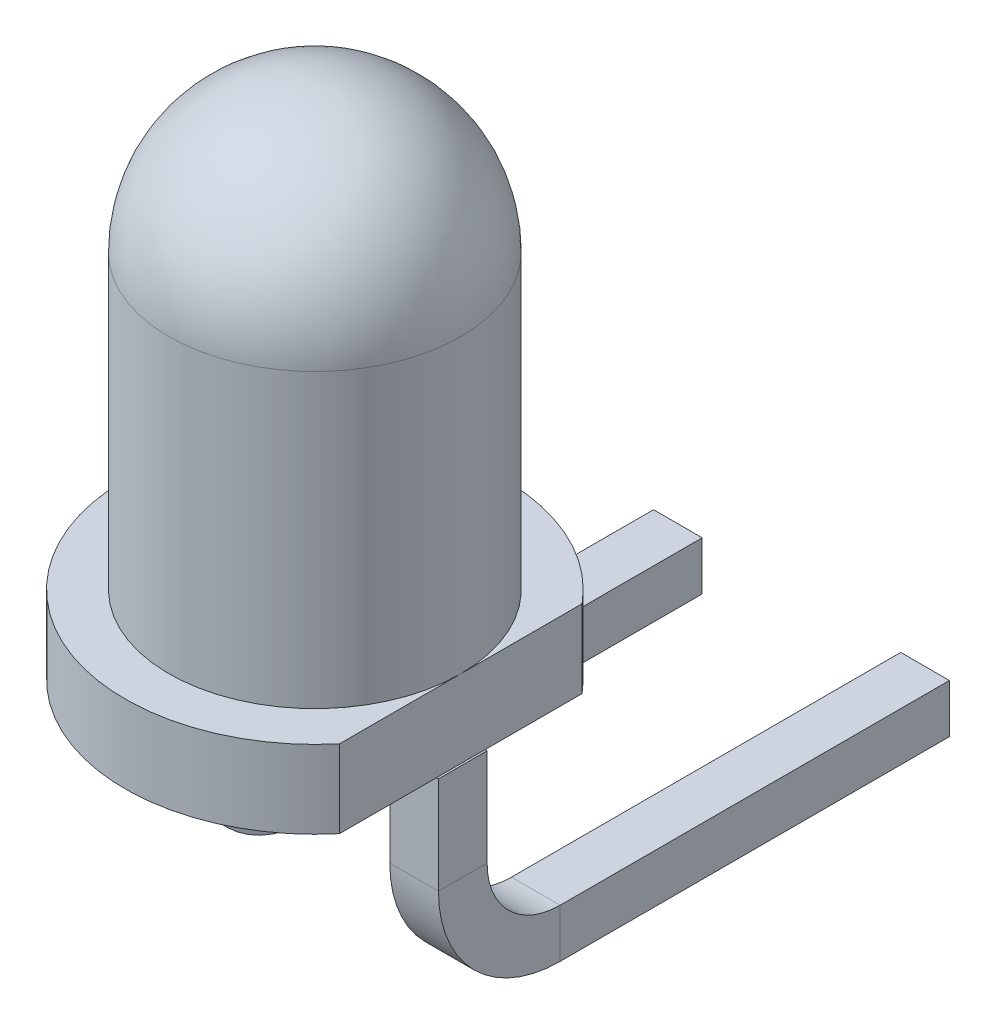
ISO-10303-21;
HEADER;
FILE_DESCRIPTION(('STEP AP214'),'2;1');
FILE_NAME('part.step','',(''),(''),'','','');
FILE_SCHEMA(('AUTOMOTIVE_DESIGN { 1 0 10303 214 1 1 1 1 }'));
ENDSEC;
DATA;
#1=APPLICATION_CONTEXT('core data for automotive mechanical design processes');
#2=APPLICATION_PROTOCOL_DEFINITION('international standard','automotive_design',2000,#1);
#3=PRODUCT_CONTEXT('',#1,'mechanical');
#4=PRODUCT('Part','Part','',(#3));
#5=PRODUCT_RELATED_PRODUCT_CATEGORY('part','',(#4));
#6=PRODUCT_DEFINITION_FORMATION('','',#4);
#7=PRODUCT_DEFINITION_CONTEXT('part definition',#1,'design');
#8=PRODUCT_DEFINITION('design','',#6,#7);
#9=PRODUCT_DEFINITION_SHAPE('','',#8);
#10=(LENGTH_UNIT() NAMED_UNIT(*) SI_UNIT(.MILLI.,.METRE.));
#11=(NAMED_UNIT(*) PLANE_ANGLE_UNIT() SI_UNIT($,.RADIAN.));
#12=(NAMED_UNIT(*) SI_UNIT($,.STERADIAN.) SOLID_ANGLE_UNIT());
#13=UNCERTAINTY_MEASURE_WITH_UNIT(LENGTH_MEASURE(1.E-05),#10,'distance_accuracy_value','');
#14=(GEOMETRIC_REPRESENTATION_CONTEXT(3) GLOBAL_UNCERTAINTY_ASSIGNED_CONTEXT((#13)) GLOBAL_UNIT_ASSIGNED_CONTEXT((#10,
#11,#12)) REPRESENTATION_CONTEXT('',''));
#15=CARTESIAN_POINT('',(0.,0.,0.));
#16=DIRECTION('',(0.,0.,1.));
#17=DIRECTION('',(1.,0.,0.));
#18=AXIS2_PLACEMENT_3D('',#15,#16,#17);
#19=CARTESIAN_POINT('',(1.95,0.,0.));
#20=DIRECTION('',(0.,1.,0.));
#21=DIRECTION('',(-1.,0.,0.));
#22=AXIS2_PLACEMENT_3D('',#19,#20,#21);
#23=PLANE('',#22);
#24=DIRECTION('',(0.,0.,-1.));
#25=VECTOR('',#24,1.);
#26=CARTESIAN_POINT('',(1.5,0.,-1.24599357943771));
#27=LINE('',#26,#25);
#28=CARTESIAN_POINT('',(1.5,0.,-0.25));
#29=VERTEX_POINT('',#28);
#30=CARTESIAN_POINT('',(1.5,0.,-1.24599357943771));
#31=VERTEX_POINT('',#30);
#32=EDGE_CURVE('E191',#29,#31,#27,.T.);
#33=ORIENTED_EDGE('',*,*,#32,.F.);
#34=DIRECTION('',(1.,0.,0.));
#35=VECTOR('',#34,1.);
#36=CARTESIAN_POINT('',(1.02,0.,-0.25));
#37=LINE('',#36,#35);
#38=CARTESIAN_POINT('',(1.02,0.,-0.25));
#39=VERTEX_POINT('',#38);
#40=EDGE_CURVE('E51',#39,#29,#37,.T.);
#41=ORIENTED_EDGE('',*,*,#40,.F.);
#42=DIRECTION('',(0.,0.,-1.));
#43=VECTOR('',#42,1.);
#44=CARTESIAN_POINT('',(1.02,0.,-0.25));
#45=LINE('',#44,#43);
#46=CARTESIAN_POINT('',(1.02,0.,0.25));
#47=VERTEX_POINT('',#46);
#48=EDGE_CURVE('E173',#47,#39,#45,.T.);
#49=ORIENTED_EDGE('',*,*,#48,.F.);
#50=DIRECTION('',(-1.,0.,0.));
#51=VECTOR('',#50,1.);
#52=CARTESIAN_POINT('',(1.02,0.,0.25));
#53=LINE('',#52,#51);
#54=CARTESIAN_POINT('',(1.5,0.,0.25));
#55=VERTEX_POINT('',#54);
#56=EDGE_CURVE('E197',#55,#47,#53,.T.);
#57=ORIENTED_EDGE('',*,*,#56,.F.);
#58=CARTESIAN_POINT('',(1.5,0.,1.24599357943771));
#59=VERTEX_POINT('',#58);
#60=EDGE_CURVE('E336',#59,#55,#27,.T.);
#61=ORIENTED_EDGE('',*,*,#60,.F.);
#62=CARTESIAN_POINT('',(0.,0.,0.));
#63=DIRECTION('',(0.,-1.,0.));
#64=DIRECTION('',(1.,0.,0.));
#65=AXIS2_PLACEMENT_3D('',#62,#63,#64);
#66=CIRCLE('',#65,1.95);
#67=EDGE_CURVE('E11',#59,#31,#66,.T.);
#68=ORIENTED_EDGE('',*,*,#67,.T.);
#69=EDGE_LOOP('',(#33,#41,#49,#57,#61,#68));
#70=FACE_BOUND('',#69,.T.);
#71=DIRECTION('',(-1.,0.,0.));
#72=VECTOR('',#71,1.);
#73=CARTESIAN_POINT('',(-1.02,0.,0.25));
#74=LINE('',#73,#72);
#75=CARTESIAN_POINT('',(-1.02,0.,0.25));
#76=VERTEX_POINT('',#75);
#77=CARTESIAN_POINT('',(-1.52,0.,0.25));
#78=VERTEX_POINT('',#77);
#79=EDGE_CURVE('E264',#76,#78,#74,.T.);
#80=ORIENTED_EDGE('',*,*,#79,.F.);
#81=DIRECTION('',(0.,0.,1.));
#82=VECTOR('',#81,1.);
#83=CARTESIAN_POINT('',(-1.02,0.,-0.25));
#84=LINE('',#83,#82);
#85=CARTESIAN_POINT('',(-1.02,0.,-0.25));
#86=VERTEX_POINT('',#85);
#87=EDGE_CURVE('E262',#86,#76,#84,.T.);
#88=ORIENTED_EDGE('',*,*,#87,.F.);
#89=DIRECTION('',(1.,0.,0.));
#90=VECTOR('',#89,1.);
#91=CARTESIAN_POINT('',(-1.02,0.,-0.25));
#92=LINE('',#91,#90);
#93=CARTESIAN_POINT('',(-1.52,0.,-0.25));
#94=VERTEX_POINT('',#93);
#95=EDGE_CURVE('E275',#94,#86,#92,.T.);
#96=ORIENTED_EDGE('',*,*,#95,.F.);
#97=DIRECTION('',(0.,0.,-1.));
#98=VECTOR('',#97,1.);
#99=CARTESIAN_POINT('',(-1.52,0.,-0.25));
#100=LINE('',#99,#98);
#101=EDGE_CURVE('E298',#78,#94,#100,.T.);
#102=ORIENTED_EDGE('',*,*,#101,.F.);
#103=EDGE_LOOP('',(#80,#88,#96,#102));
#104=FACE_BOUND('',#103,.T.);
#105=ADVANCED_FACE('F37',(#70,#104),#23,.F.);
#106=CARTESIAN_POINT('',(0.,0.,0.));
#107=DIRECTION('',(0.,-1.,0.));
#108=DIRECTION('',(1.,0.,0.));
#109=AXIS2_PLACEMENT_3D('',#106,#107,#108);
#110=CYLINDRICAL_SURFACE('',#109,1.95);
#111=CARTESIAN_POINT('',(0.,0.8,0.));
#112=DIRECTION('',(0.,-1.,0.));
#113=DIRECTION('',(1.,0.,0.));
#114=AXIS2_PLACEMENT_3D('',#111,#112,#113);
#115=CIRCLE('',#114,1.95);
#116=CARTESIAN_POINT('',(1.5,0.799999999999999,1.24599357943771));
#117=VERTEX_POINT('',#116);
#118=CARTESIAN_POINT('',(1.5,0.8,-1.24599357943771));
#119=VERTEX_POINT('',#118);
#120=EDGE_CURVE('E44',#117,#119,#115,.T.);
#121=ORIENTED_EDGE('',*,*,#120,.T.);
#122=DIRECTION('',(0.,-1.,0.));
#123=VECTOR('',#122,1.);
#124=CARTESIAN_POINT('',(1.5,5.3,-1.24599357943771));
#125=LINE('',#124,#123);
#126=EDGE_CURVE('E341',#119,#31,#125,.T.);
#127=ORIENTED_EDGE('',*,*,#126,.T.);
#128=ORIENTED_EDGE('',*,*,#67,.F.);
#129=DIRECTION('',(0.,-1.,0.));
#130=VECTOR('',#129,1.);
#131=CARTESIAN_POINT('',(1.5,5.3,1.24599357943771));
#132=LINE('',#131,#130);
#133=EDGE_CURVE('E339',#117,#59,#132,.T.);
#134=ORIENTED_EDGE('',*,*,#133,.F.);
#135=EDGE_LOOP('',(#121,#127,#128,#134));
#136=FACE_BOUND('',#135,.T.);
#137=ADVANCED_FACE('F358',(#136),#110,.T.);
#138=CARTESIAN_POINT('',(1.5,0.8,0.));
#139=DIRECTION('',(0.,-1.,0.));
#140=DIRECTION('',(1.,0.,0.));
#141=AXIS2_PLACEMENT_3D('',#138,#139,#140);
#142=PLANE('',#141);
#143=ORIENTED_EDGE('',*,*,#120,.F.);
#144=DIRECTION('',(0.,0.,-1.));
#145=VECTOR('',#144,1.);
#146=CARTESIAN_POINT('',(1.5,0.8,0.));
#147=LINE('',#146,#145);
#148=CARTESIAN_POINT('',(1.5,0.8,0.));
#149=VERTEX_POINT('',#148);
#150=EDGE_CURVE('E348',#117,#149,#147,.T.);
#151=ORIENTED_EDGE('',*,*,#150,.T.);
#152=CARTESIAN_POINT('',(0.,0.8,0.));
#153=DIRECTION('',(0.,-1.,0.));
#154=DIRECTION('',(1.,0.,0.));
#155=AXIS2_PLACEMENT_3D('',#152,#153,#154);
#156=CIRCLE('',#155,1.5);
#157=EDGE_CURVE('E352',#149,#149,#156,.T.);
#158=ORIENTED_EDGE('',*,*,#157,.T.);
#159=EDGE_CURVE('E344',#149,#119,#147,.T.);
#160=ORIENTED_EDGE('',*,*,#159,.T.);
#161=EDGE_LOOP('',(#143,#151,#158,#160));
#162=FACE_BOUND('',#161,.T.);
#163=ADVANCED_FACE('F362',(#162),#142,.F.);
#164=CARTESIAN_POINT('',(0.,0.,0.));
#165=DIRECTION('',(0.,-1.,0.));
#166=DIRECTION('',(1.,0.,0.));
#167=AXIS2_PLACEMENT_3D('',#164,#165,#166);
#168=CYLINDRICAL_SURFACE('',#167,1.5);
#169=ORIENTED_EDGE('',*,*,#157,.F.);
#170=EDGE_LOOP('',(#169));
#171=FACE_BOUND('',#170,.T.);
#172=CARTESIAN_POINT('',(0.,3.8,0.));
#173=DIRECTION('',(0.,-1.,0.));
#174=DIRECTION('',(1.,0.,0.));
#175=AXIS2_PLACEMENT_3D('',#172,#173,#174);
#176=CIRCLE('',#175,1.5);
#177=CARTESIAN_POINT('',(1.5,3.8,0.));
#178=VERTEX_POINT('',#177);
#179=EDGE_CURVE('E349',#178,#178,#176,.T.);
#180=ORIENTED_EDGE('',*,*,#179,.T.);
#181=EDGE_LOOP('',(#180));
#182=FACE_BOUND('',#181,.T.);
#183=ADVANCED_FACE('F422',(#171,#182),#168,.T.);
#184=CARTESIAN_POINT('',(0.,3.8,0.));
#185=DIRECTION('',(0.,-1.,0.));
#186=DIRECTION('',(1.,0.,0.));
#187=AXIS2_PLACEMENT_3D('',#184,#185,#186);
#188=SPHERICAL_SURFACE('',#187,1.5);
#189=ORIENTED_EDGE('',*,*,#179,.F.);
#190=EDGE_LOOP('',(#189));
#191=FACE_BOUND('',#190,.T.);
#192=ADVANCED_FACE('F427',(#191),#188,.T.);
#193=CARTESIAN_POINT('',(1.5,5.3,-1.24599357943771));
#194=DIRECTION('',(-1.,0.,0.));
#195=DIRECTION('',(0.,0.,1.));
#196=AXIS2_PLACEMENT_3D('',#193,#194,#195);
#197=PLANE('',#196);
#198=ORIENTED_EDGE('',*,*,#133,.T.);
#199=ORIENTED_EDGE('',*,*,#60,.T.);
#200=EDGE_CURVE('E340',#55,#29,#27,.T.);
#201=ORIENTED_EDGE('',*,*,#200,.T.);
#202=ORIENTED_EDGE('',*,*,#32,.T.);
#203=ORIENTED_EDGE('',*,*,#126,.F.);
#204=ORIENTED_EDGE('',*,*,#159,.F.);
#205=ORIENTED_EDGE('',*,*,#150,.F.);
#206=EDGE_LOOP('',(#198,#199,#201,#202,#203,#204,#205));
#207=FACE_BOUND('',#206,.T.);
#208=ADVANCED_FACE('F365',(#207),#197,.F.);
#209=CARTESIAN_POINT('',(0.,-2.,-5.));
#210=DIRECTION('',(0.,0.,-1.));
#211=DIRECTION('',(0.,1.,0.));
#212=AXIS2_PLACEMENT_3D('',#209,#210,#211);
#213=PLANE('',#212);
#214=DIRECTION('',(0.,1.,0.));
#215=VECTOR('',#214,1.);
#216=CARTESIAN_POINT('',(-1.52,-1.75,-5.));
#217=LINE('',#216,#215);
#218=CARTESIAN_POINT('',(-1.52,-2.25,-5.));
#219=VERTEX_POINT('',#218);
#220=CARTESIAN_POINT('',(-1.52,-1.75,-5.));
#221=VERTEX_POINT('',#220);
#222=EDGE_CURVE('E315',#219,#221,#217,.T.);
#223=ORIENTED_EDGE('',*,*,#222,.T.);
#224=DIRECTION('',(1.,0.,0.));
#225=VECTOR('',#224,1.);
#226=CARTESIAN_POINT('',(-1.02,-1.75,-5.));
#227=LINE('',#226,#225);
#228=CARTESIAN_POINT('',(-1.02,-1.75,-5.));
#229=VERTEX_POINT('',#228);
#230=EDGE_CURVE('E329',#221,#229,#227,.T.);
#231=ORIENTED_EDGE('',*,*,#230,.T.);
#232=DIRECTION('',(0.,-1.,0.));
#233=VECTOR('',#232,1.);
#234=CARTESIAN_POINT('',(-1.02,-1.75,-5.));
#235=LINE('',#234,#233);
#236=CARTESIAN_POINT('',(-1.02,-2.25,-5.));
#237=VERTEX_POINT('',#236);
#238=EDGE_CURVE('E287',#229,#237,#235,.T.);
#239=ORIENTED_EDGE('',*,*,#238,.T.);
#240=DIRECTION('',(-1.,0.,0.));
#241=VECTOR('',#240,1.);
#242=CARTESIAN_POINT('',(-1.02,-2.25,-5.));
#243=LINE('',#242,#241);
#244=EDGE_CURVE('E293',#237,#219,#243,.T.);
#245=ORIENTED_EDGE('',*,*,#244,.T.);
#246=EDGE_LOOP('',(#223,#231,#239,#245));
#247=FACE_BOUND('',#246,.T.);
#248=ADVANCED_FACE('F413',(#247),#213,.T.);
#249=CARTESIAN_POINT('',(-1.02,0.,-0.25));
#250=DIRECTION('',(1.,0.,0.));
#251=DIRECTION('',(0.,0.,-1.));
#252=AXIS2_PLACEMENT_3D('',#249,#250,#251);
#253=PLANE('',#252);
#254=DIRECTION('',(0.,-1.,0.));
#255=VECTOR('',#254,1.);
#256=CARTESIAN_POINT('',(-1.02,0.,0.25));
#257=LINE('',#256,#255);
#258=CARTESIAN_POINT('',(-1.02,-1.,0.25));
#259=VERTEX_POINT('',#258);
#260=EDGE_CURVE('E268',#76,#259,#257,.T.);
#261=ORIENTED_EDGE('',*,*,#260,.T.);
#262=DIRECTION('',(0.,0.,1.));
#263=VECTOR('',#262,1.);
#264=CARTESIAN_POINT('',(-1.02,-1.,-0.25));
#265=LINE('',#264,#263);
#266=CARTESIAN_POINT('',(-1.02,-1.,-0.25));
#267=VERTEX_POINT('',#266);
#268=EDGE_CURVE('E265',#267,#259,#265,.T.);
#269=ORIENTED_EDGE('',*,*,#268,.F.);
#270=DIRECTION('',(0.,-1.,0.));
#271=VECTOR('',#270,1.);
#272=CARTESIAN_POINT('',(-1.02,0.,-0.25));
#273=LINE('',#272,#271);
#274=EDGE_CURVE('E269',#86,#267,#273,.T.);
#275=ORIENTED_EDGE('',*,*,#274,.F.);
#276=ORIENTED_EDGE('',*,*,#87,.T.);
#277=EDGE_LOOP('',(#261,#269,#275,#276));
#278=FACE_BOUND('',#277,.T.);
#279=ADVANCED_FACE('F436',(#278),#253,.T.);
#280=CARTESIAN_POINT('',(-1.02,0.,0.25));
#281=DIRECTION('',(0.,0.,1.));
#282=DIRECTION('',(0.,-1.,0.));
#283=AXIS2_PLACEMENT_3D('',#280,#281,#282);
#284=PLANE('',#283);
#285=DIRECTION('',(0.,-1.,0.));
#286=VECTOR('',#285,1.);
#287=CARTESIAN_POINT('',(-1.52,0.,0.25));
#288=LINE('',#287,#286);
#289=CARTESIAN_POINT('',(-1.52,-1.,0.25));
#290=VERTEX_POINT('',#289);
#291=EDGE_CURVE('E301',#78,#290,#288,.T.);
#292=ORIENTED_EDGE('',*,*,#291,.T.);
#293=DIRECTION('',(-1.,0.,0.));
#294=VECTOR('',#293,1.);
#295=CARTESIAN_POINT('',(-1.02,-1.,0.25));
#296=LINE('',#295,#294);
#297=EDGE_CURVE('E272',#259,#290,#296,.T.);
#298=ORIENTED_EDGE('',*,*,#297,.F.);
#299=ORIENTED_EDGE('',*,*,#260,.F.);
#300=ORIENTED_EDGE('',*,*,#79,.T.);
#301=EDGE_LOOP('',(#292,#298,#299,#300));
#302=FACE_BOUND('',#301,.T.);
#303=ADVANCED_FACE('F463',(#302),#284,.T.);
#304=CARTESIAN_POINT('',(-1.52,0.,-0.25));
#305=DIRECTION('',(-1.,0.,0.));
#306=DIRECTION('',(0.,0.,1.));
#307=AXIS2_PLACEMENT_3D('',#304,#305,#306);
#308=PLANE('',#307);
#309=DIRECTION('',(0.,-1.,0.));
#310=VECTOR('',#309,1.);
#311=CARTESIAN_POINT('',(-1.52,0.,-0.25));
#312=LINE('',#311,#310);
#313=CARTESIAN_POINT('',(-1.52,-1.,-0.25));
#314=VERTEX_POINT('',#313);
#315=EDGE_CURVE('E59',#94,#314,#312,.T.);
#316=ORIENTED_EDGE('',*,*,#315,.T.);
#317=DIRECTION('',(0.,0.,-1.));
#318=VECTOR('',#317,1.);
#319=CARTESIAN_POINT('',(-1.52,-1.,-0.25));
#320=LINE('',#319,#318);
#321=EDGE_CURVE('E304',#290,#314,#320,.T.);
#322=ORIENTED_EDGE('',*,*,#321,.F.);
#323=ORIENTED_EDGE('',*,*,#291,.F.);
#324=ORIENTED_EDGE('',*,*,#101,.T.);
#325=EDGE_LOOP('',(#316,#322,#323,#324));
#326=FACE_BOUND('',#325,.T.);
#327=ADVANCED_FACE('F452',(#326),#308,.T.);
#328=CARTESIAN_POINT('',(-1.02,0.,-0.25));
#329=DIRECTION('',(0.,0.,-1.));
#330=DIRECTION('',(0.,1.,0.));
#331=AXIS2_PLACEMENT_3D('',#328,#329,#330);
#332=PLANE('',#331);
#333=DIRECTION('',(1.,0.,0.));
#334=VECTOR('',#333,1.);
#335=CARTESIAN_POINT('',(-1.02,-1.,-0.25));
#336=LINE('',#335,#334);
#337=EDGE_CURVE('E286',#314,#267,#336,.T.);
#338=ORIENTED_EDGE('',*,*,#337,.F.);
#339=ORIENTED_EDGE('',*,*,#315,.F.);
#340=ORIENTED_EDGE('',*,*,#95,.T.);
#341=ORIENTED_EDGE('',*,*,#274,.T.);
#342=EDGE_LOOP('',(#338,#339,#340,#341));
#343=FACE_BOUND('',#342,.T.);
#344=ADVANCED_FACE('F448',(#343),#332,.T.);
#345=CARTESIAN_POINT('',(-1.02,-1.,-0.25));
#346=DIRECTION('',(1.,0.,0.));
#347=DIRECTION('',(0.,0.,-1.));
#348=AXIS2_PLACEMENT_3D('',#345,#346,#347);
#349=PLANE('',#348);
#350=CARTESIAN_POINT('',(-1.02,-1.,-1.));
#351=DIRECTION('',(1.,0.,0.));
#352=DIRECTION('',(0.,0.,1.));
#353=AXIS2_PLACEMENT_3D('',#350,#351,#352);
#354=CIRCLE('',#353,1.25);
#355=CARTESIAN_POINT('',(-1.02,-2.25,-1.));
#356=VERTEX_POINT('',#355);
#357=EDGE_CURVE('E279',#259,#356,#354,.T.);
#358=ORIENTED_EDGE('',*,*,#357,.T.);
#359=DIRECTION('',(0.,-1.,0.));
#360=VECTOR('',#359,1.);
#361=CARTESIAN_POINT('',(-1.02,-1.75,-1.));
#362=LINE('',#361,#360);
#363=CARTESIAN_POINT('',(-1.02,-1.75,-1.));
#364=VERTEX_POINT('',#363);
#365=EDGE_CURVE('E276',#364,#356,#362,.T.);
#366=ORIENTED_EDGE('',*,*,#365,.F.);
#367=CARTESIAN_POINT('',(-1.02,-1.,-1.));
#368=DIRECTION('',(1.,0.,0.));
#369=DIRECTION('',(0.,0.,1.));
#370=AXIS2_PLACEMENT_3D('',#367,#368,#369);
#371=CIRCLE('',#370,0.75);
#372=EDGE_CURVE('E280',#267,#364,#371,.T.);
#373=ORIENTED_EDGE('',*,*,#372,.F.);
#374=ORIENTED_EDGE('',*,*,#268,.T.);
#375=EDGE_LOOP('',(#358,#366,#373,#374));
#376=FACE_BOUND('',#375,.T.);
#377=ADVANCED_FACE('F451',(#376),#349,.T.);
#378=CARTESIAN_POINT('',(-1.27,-1.,-1.));
#379=DIRECTION('',(1.,0.,0.));
#380=DIRECTION('',(0.,0.,-1.));
#381=AXIS2_PLACEMENT_3D('',#378,#379,#380);
#382=CYLINDRICAL_SURFACE('',#381,1.25);
#383=CARTESIAN_POINT('',(-1.52,-1.,-1.));
#384=DIRECTION('',(1.,0.,0.));
#385=DIRECTION('',(0.,0.,1.));
#386=AXIS2_PLACEMENT_3D('',#383,#384,#385);
#387=CIRCLE('',#386,1.25);
#388=CARTESIAN_POINT('',(-1.52,-2.25,-1.));
#389=VERTEX_POINT('',#388);
#390=EDGE_CURVE('E307',#290,#389,#387,.T.);
#391=ORIENTED_EDGE('',*,*,#390,.T.);
#392=DIRECTION('',(-1.,0.,0.));
#393=VECTOR('',#392,1.);
#394=CARTESIAN_POINT('',(-1.02,-2.25,-1.));
#395=LINE('',#394,#393);
#396=EDGE_CURVE('E283',#356,#389,#395,.T.);
#397=ORIENTED_EDGE('',*,*,#396,.F.);
#398=ORIENTED_EDGE('',*,*,#357,.F.);
#399=ORIENTED_EDGE('',*,*,#297,.T.);
#400=EDGE_LOOP('',(#391,#397,#398,#399));
#401=FACE_BOUND('',#400,.T.);
#402=ADVANCED_FACE('F459',(#401),#382,.T.);
#403=CARTESIAN_POINT('',(-1.52,-1.,-0.25));
#404=DIRECTION('',(-1.,0.,0.));
#405=DIRECTION('',(0.,0.,1.));
#406=AXIS2_PLACEMENT_3D('',#403,#404,#405);
#407=PLANE('',#406);
#408=CARTESIAN_POINT('',(-1.52,-1.,-1.));
#409=DIRECTION('',(1.,0.,0.));
#410=DIRECTION('',(0.,0.,1.));
#411=AXIS2_PLACEMENT_3D('',#408,#409,#410);
#412=CIRCLE('',#411,0.75);
#413=CARTESIAN_POINT('',(-1.52,-1.75,-1.));
#414=VERTEX_POINT('',#413);
#415=EDGE_CURVE('E322',#314,#414,#412,.T.);
#416=ORIENTED_EDGE('',*,*,#415,.T.);
#417=DIRECTION('',(0.,1.,0.));
#418=VECTOR('',#417,1.);
#419=CARTESIAN_POINT('',(-1.52,-1.75,-1.));
#420=LINE('',#419,#418);
#421=EDGE_CURVE('E310',#389,#414,#420,.T.);
#422=ORIENTED_EDGE('',*,*,#421,.F.);
#423=ORIENTED_EDGE('',*,*,#390,.F.);
#424=ORIENTED_EDGE('',*,*,#321,.T.);
#425=EDGE_LOOP('',(#416,#422,#423,#424));
#426=FACE_BOUND('',#425,.T.);
#427=ADVANCED_FACE('F446',(#426),#407,.T.);
#428=CARTESIAN_POINT('',(-1.27,-1.,-1.));
#429=DIRECTION('',(1.,0.,0.));
#430=DIRECTION('',(0.,0.,-1.));
#431=AXIS2_PLACEMENT_3D('',#428,#429,#430);
#432=CYLINDRICAL_SURFACE('',#431,0.75);
#433=DIRECTION('',(1.,0.,0.));
#434=VECTOR('',#433,1.);
#435=CARTESIAN_POINT('',(-1.02,-1.75,-1.));
#436=LINE('',#435,#434);
#437=EDGE_CURVE('E296',#414,#364,#436,.T.);
#438=ORIENTED_EDGE('',*,*,#437,.F.);
#439=ORIENTED_EDGE('',*,*,#415,.F.);
#440=ORIENTED_EDGE('',*,*,#337,.T.);
#441=ORIENTED_EDGE('',*,*,#372,.T.);
#442=EDGE_LOOP('',(#438,#439,#440,#441));
#443=FACE_BOUND('',#442,.T.);
#444=ADVANCED_FACE('F442',(#443),#432,.F.);
#445=CARTESIAN_POINT('',(-1.02,-1.75,-1.));
#446=DIRECTION('',(1.,0.,0.));
#447=DIRECTION('',(0.,0.,-1.));
#448=AXIS2_PLACEMENT_3D('',#445,#446,#447);
#449=PLANE('',#448);
#450=DIRECTION('',(0.,0.,-1.));
#451=VECTOR('',#450,1.);
#452=CARTESIAN_POINT('',(-1.02,-2.25,-1.));
#453=LINE('',#452,#451);
#454=EDGE_CURVE('E289',#356,#237,#453,.T.);
#455=ORIENTED_EDGE('',*,*,#454,.T.);
#456=ORIENTED_EDGE('',*,*,#238,.F.);
#457=DIRECTION('',(0.,0.,-1.));
#458=VECTOR('',#457,1.);
#459=CARTESIAN_POINT('',(-1.02,-1.75,-1.));
#460=LINE('',#459,#458);
#461=EDGE_CURVE('E290',#364,#229,#460,.T.);
#462=ORIENTED_EDGE('',*,*,#461,.F.);
#463=ORIENTED_EDGE('',*,*,#365,.T.);
#464=EDGE_LOOP('',(#455,#456,#462,#463));
#465=FACE_BOUND('',#464,.T.);
#466=ADVANCED_FACE('F445',(#465),#449,.T.);
#467=CARTESIAN_POINT('',(-1.02,-2.25,-1.));
#468=DIRECTION('',(0.,-1.,0.));
#469=DIRECTION('',(0.,0.,-1.));
#470=AXIS2_PLACEMENT_3D('',#467,#468,#469);
#471=PLANE('',#470);
#472=DIRECTION('',(0.,0.,-1.));
#473=VECTOR('',#472,1.);
#474=CARTESIAN_POINT('',(-1.52,-2.25,-1.));
#475=LINE('',#474,#473);
#476=EDGE_CURVE('E312',#389,#219,#475,.T.);
#477=ORIENTED_EDGE('',*,*,#476,.T.);
#478=ORIENTED_EDGE('',*,*,#244,.F.);
#479=ORIENTED_EDGE('',*,*,#454,.F.);
#480=ORIENTED_EDGE('',*,*,#396,.T.);
#481=EDGE_LOOP('',(#477,#478,#479,#480));
#482=FACE_BOUND('',#481,.T.);
#483=ADVANCED_FACE('F455',(#482),#471,.T.);
#484=CARTESIAN_POINT('',(-1.52,-1.75,-1.));
#485=DIRECTION('',(-1.,0.,0.));
#486=DIRECTION('',(0.,0.,1.));
#487=AXIS2_PLACEMENT_3D('',#484,#485,#486);
#488=PLANE('',#487);
#489=DIRECTION('',(0.,0.,-1.));
#490=VECTOR('',#489,1.);
#491=CARTESIAN_POINT('',(-1.52,-1.75,-1.));
#492=LINE('',#491,#490);
#493=EDGE_CURVE('E326',#414,#221,#492,.T.);
#494=ORIENTED_EDGE('',*,*,#493,.T.);
#495=ORIENTED_EDGE('',*,*,#222,.F.);
#496=ORIENTED_EDGE('',*,*,#476,.F.);
#497=ORIENTED_EDGE('',*,*,#421,.T.);
#498=EDGE_LOOP('',(#494,#495,#496,#497));
#499=FACE_BOUND('',#498,.T.);
#500=ADVANCED_FACE('F440',(#499),#488,.T.);
#501=CARTESIAN_POINT('',(-1.02,-1.75,-1.));
#502=DIRECTION('',(0.,1.,0.));
#503=DIRECTION('',(0.,0.,1.));
#504=AXIS2_PLACEMENT_3D('',#501,#502,#503);
#505=PLANE('',#504);
#506=ORIENTED_EDGE('',*,*,#230,.F.);
#507=ORIENTED_EDGE('',*,*,#493,.F.);
#508=ORIENTED_EDGE('',*,*,#437,.T.);
#509=ORIENTED_EDGE('',*,*,#461,.T.);
#510=EDGE_LOOP('',(#506,#507,#508,#509));
#511=FACE_BOUND('',#510,.T.);
#512=ADVANCED_FACE('F411',(#511),#505,.T.);
#513=CARTESIAN_POINT('',(0.,0.,0.));
#514=DIRECTION('',(0.,-1.,0.));
#515=DIRECTION('',(0.,0.,-1.));
#516=AXIS2_PLACEMENT_3D('',#513,#514,#515);
#517=PLANE('',#516);
#518=CARTESIAN_POINT('',(1.52,0.,-0.25));
#519=VERTEX_POINT('',#518);
#520=EDGE_CURVE('E194',#29,#519,#37,.T.);
#521=ORIENTED_EDGE('',*,*,#520,.F.);
#522=ORIENTED_EDGE('',*,*,#200,.F.);
#523=CARTESIAN_POINT('',(1.52,0.,0.25));
#524=VERTEX_POINT('',#523);
#525=EDGE_CURVE('E181',#524,#55,#53,.T.);
#526=ORIENTED_EDGE('',*,*,#525,.F.);
#527=DIRECTION('',(0.,0.,1.));
#528=VECTOR('',#527,1.);
#529=CARTESIAN_POINT('',(1.52,0.,-0.25));
#530=LINE('',#529,#528);
#531=EDGE_CURVE('E193',#519,#524,#530,.T.);
#532=ORIENTED_EDGE('',*,*,#531,.F.);
#533=EDGE_LOOP('',(#521,#522,#526,#532));
#534=FACE_BOUND('',#533,.T.);
#535=ADVANCED_FACE('F368',(#534),#517,.F.);
#536=CARTESIAN_POINT('',(0.,-2.,-5.));
#537=DIRECTION('',(0.,0.,-1.));
#538=DIRECTION('',(0.,1.,0.));
#539=AXIS2_PLACEMENT_3D('',#536,#537,#538);
#540=PLANE('',#539);
#541=DIRECTION('',(1.,0.,0.));
#542=VECTOR('',#541,1.);
#543=CARTESIAN_POINT('',(1.02,-1.75,-5.));
#544=LINE('',#543,#542);
#545=CARTESIAN_POINT('',(1.02,-1.75,-5.));
#546=VERTEX_POINT('',#545);
#547=CARTESIAN_POINT('',(1.52,-1.75,-5.));
#548=VERTEX_POINT('',#547);
#549=EDGE_CURVE('E215',#546,#548,#544,.T.);
#550=ORIENTED_EDGE('',*,*,#549,.T.);
#551=DIRECTION('',(0.,-1.,0.));
#552=VECTOR('',#551,1.);
#553=CARTESIAN_POINT('',(1.52,-1.75,-5.));
#554=LINE('',#553,#552);
#555=CARTESIAN_POINT('',(1.52,-2.25,-5.));
#556=VERTEX_POINT('',#555);
#557=EDGE_CURVE('E221',#548,#556,#554,.T.);
#558=ORIENTED_EDGE('',*,*,#557,.T.);
#559=DIRECTION('',(-1.,0.,0.));
#560=VECTOR('',#559,1.);
#561=CARTESIAN_POINT('',(1.02,-2.25,-5.));
#562=LINE('',#561,#560);
#563=CARTESIAN_POINT('',(1.02,-2.25,-5.));
#564=VERTEX_POINT('',#563);
#565=EDGE_CURVE('E241',#556,#564,#562,.T.);
#566=ORIENTED_EDGE('',*,*,#565,.T.);
#567=DIRECTION('',(0.,1.,0.));
#568=VECTOR('',#567,1.);
#569=CARTESIAN_POINT('',(1.02,-1.75,-5.));
#570=LINE('',#569,#568);
#571=EDGE_CURVE('E255',#564,#546,#570,.T.);
#572=ORIENTED_EDGE('',*,*,#571,.T.);
#573=EDGE_LOOP('',(#550,#558,#566,#572));
#574=FACE_BOUND('',#573,.T.);
#575=ADVANCED_FACE('F403',(#574),#540,.T.);
#576=CARTESIAN_POINT('',(1.02,0.,-0.25));
#577=DIRECTION('',(0.,0.,-1.));
#578=DIRECTION('',(-1.,0.,0.));
#579=AXIS2_PLACEMENT_3D('',#576,#577,#578);
#580=PLANE('',#579);
#581=DIRECTION('',(0.,-1.,0.));
#582=VECTOR('',#581,1.);
#583=CARTESIAN_POINT('',(1.52,0.,-0.25));
#584=LINE('',#583,#582);
#585=CARTESIAN_POINT('',(1.52,-1.,-0.25));
#586=VERTEX_POINT('',#585);
#587=EDGE_CURVE('E201',#519,#586,#584,.T.);
#588=ORIENTED_EDGE('',*,*,#587,.T.);
#589=DIRECTION('',(1.,0.,0.));
#590=VECTOR('',#589,1.);
#591=CARTESIAN_POINT('',(1.02,-1.,-0.25));
#592=LINE('',#591,#590);
#593=CARTESIAN_POINT('',(1.02,-1.,-0.25));
#594=VERTEX_POINT('',#593);
#595=EDGE_CURVE('E187',#594,#586,#592,.T.);
#596=ORIENTED_EDGE('',*,*,#595,.F.);
#597=DIRECTION('',(0.,-1.,0.));
#598=VECTOR('',#597,1.);
#599=CARTESIAN_POINT('',(1.02,0.,-0.25));
#600=LINE('',#599,#598);
#601=EDGE_CURVE('E176',#39,#594,#600,.T.);
#602=ORIENTED_EDGE('',*,*,#601,.F.);
#603=ORIENTED_EDGE('',*,*,#40,.T.);
#604=ORIENTED_EDGE('',*,*,#520,.T.);
#605=EDGE_LOOP('',(#588,#596,#602,#603,#604));
#606=FACE_BOUND('',#605,.T.);
#607=ADVANCED_FACE('F185',(#606),#580,.T.);
#608=CARTESIAN_POINT('',(1.52,0.,-0.25));
#609=DIRECTION('',(1.,0.,0.));
#610=DIRECTION('',(0.,0.,-1.));
#611=AXIS2_PLACEMENT_3D('',#608,#609,#610);
#612=PLANE('',#611);
#613=DIRECTION('',(0.,-1.,0.));
#614=VECTOR('',#613,1.);
#615=CARTESIAN_POINT('',(1.52,0.,0.25));
#616=LINE('',#615,#614);
#617=CARTESIAN_POINT('',(1.52,-1.,0.25));
#618=VERTEX_POINT('',#617);
#619=EDGE_CURVE('E227',#524,#618,#616,.T.);
#620=ORIENTED_EDGE('',*,*,#619,.T.);
#621=DIRECTION('',(0.,0.,1.));
#622=VECTOR('',#621,1.);
#623=CARTESIAN_POINT('',(1.52,-1.,-0.25));
#624=LINE('',#623,#622);
#625=EDGE_CURVE('E202',#586,#618,#624,.T.);
#626=ORIENTED_EDGE('',*,*,#625,.F.);
#627=ORIENTED_EDGE('',*,*,#587,.F.);
#628=ORIENTED_EDGE('',*,*,#531,.T.);
#629=EDGE_LOOP('',(#620,#626,#627,#628));
#630=FACE_BOUND('',#629,.T.);
#631=ADVANCED_FACE('F376',(#630),#612,.T.);
#632=CARTESIAN_POINT('',(1.02,0.,0.25));
#633=DIRECTION('',(0.,0.,1.));
#634=DIRECTION('',(1.,0.,0.));
#635=AXIS2_PLACEMENT_3D('',#632,#633,#634);
#636=PLANE('',#635);
#637=DIRECTION('',(0.,-1.,0.));
#638=VECTOR('',#637,1.);
#639=CARTESIAN_POINT('',(1.02,0.,0.25));
#640=LINE('',#639,#638);
#641=CARTESIAN_POINT('',(1.02,-1.,0.25));
#642=VERTEX_POINT('',#641);
#643=EDGE_CURVE('E178',#47,#642,#640,.T.);
#644=ORIENTED_EDGE('',*,*,#643,.T.);
#645=DIRECTION('',(-1.,0.,0.));
#646=VECTOR('',#645,1.);
#647=CARTESIAN_POINT('',(1.02,-1.,0.25));
#648=LINE('',#647,#646);
#649=EDGE_CURVE('E230',#618,#642,#648,.T.);
#650=ORIENTED_EDGE('',*,*,#649,.F.);
#651=ORIENTED_EDGE('',*,*,#619,.F.);
#652=ORIENTED_EDGE('',*,*,#525,.T.);
#653=ORIENTED_EDGE('',*,*,#56,.T.);
#654=EDGE_LOOP('',(#644,#650,#651,#652,#653));
#655=FACE_BOUND('',#654,.T.);
#656=ADVANCED_FACE('F372',(#655),#636,.T.);
#657=CARTESIAN_POINT('',(1.02,0.,-0.25));
#658=DIRECTION('',(-1.,0.,0.));
#659=DIRECTION('',(0.,0.,1.));
#660=AXIS2_PLACEMENT_3D('',#657,#658,#659);
#661=PLANE('',#660);
#662=DIRECTION('',(0.,0.,-1.));
#663=VECTOR('',#662,1.);
#664=CARTESIAN_POINT('',(1.02,-1.,-0.25));
#665=LINE('',#664,#663);
#666=EDGE_CURVE('E214',#642,#594,#665,.T.);
#667=ORIENTED_EDGE('',*,*,#666,.F.);
#668=ORIENTED_EDGE('',*,*,#643,.F.);
#669=ORIENTED_EDGE('',*,*,#48,.T.);
#670=ORIENTED_EDGE('',*,*,#601,.T.);
#671=EDGE_LOOP('',(#667,#668,#669,#670));
#672=FACE_BOUND('',#671,.T.);
#673=ADVANCED_FACE('F175',(#672),#661,.T.);
#674=CARTESIAN_POINT('',(-1.27,-1.,-1.));
#675=DIRECTION('',(1.,0.,0.));
#676=DIRECTION('',(0.,0.,-1.));
#677=AXIS2_PLACEMENT_3D('',#674,#675,#676);
#678=CYLINDRICAL_SURFACE('',#677,0.75);
#679=CARTESIAN_POINT('',(1.52,-1.,-1.));
#680=DIRECTION('',(1.,0.,0.));
#681=DIRECTION('',(0.,0.,1.));
#682=AXIS2_PLACEMENT_3D('',#679,#680,#681);
#683=CIRCLE('',#682,0.75);
#684=CARTESIAN_POINT('',(1.52,-1.75,-1.));
#685=VERTEX_POINT('',#684);
#686=EDGE_CURVE('E207',#586,#685,#683,.T.);
#687=ORIENTED_EDGE('',*,*,#686,.T.);
#688=DIRECTION('',(1.,0.,0.));
#689=VECTOR('',#688,1.);
#690=CARTESIAN_POINT('',(1.02,-1.75,-1.));
#691=LINE('',#690,#689);
#692=CARTESIAN_POINT('',(1.02,-1.75,-1.));
#693=VERTEX_POINT('',#692);
#694=EDGE_CURVE('E204',#693,#685,#691,.T.);
#695=ORIENTED_EDGE('',*,*,#694,.F.);
#696=CARTESIAN_POINT('',(1.02,-1.,-1.));
#697=DIRECTION('',(1.,0.,0.));
#698=DIRECTION('',(0.,0.,1.));
#699=AXIS2_PLACEMENT_3D('',#696,#697,#698);
#700=CIRCLE('',#699,0.75);
#701=EDGE_CURVE('E208',#594,#693,#700,.T.);
#702=ORIENTED_EDGE('',*,*,#701,.F.);
#703=ORIENTED_EDGE('',*,*,#595,.T.);
#704=EDGE_LOOP('',(#687,#695,#702,#703));
#705=FACE_BOUND('',#704,.T.);
#706=ADVANCED_FACE('F383',(#705),#678,.F.);
#707=CARTESIAN_POINT('',(1.52,-1.,-0.25));
#708=DIRECTION('',(1.,0.,0.));
#709=DIRECTION('',(0.,0.,-1.));
#710=AXIS2_PLACEMENT_3D('',#707,#708,#709);
#711=PLANE('',#710);
#712=CARTESIAN_POINT('',(1.52,-1.,-1.));
#713=DIRECTION('',(1.,0.,0.));
#714=DIRECTION('',(0.,0.,1.));
#715=AXIS2_PLACEMENT_3D('',#712,#713,#714);
#716=CIRCLE('',#715,1.25);
#717=CARTESIAN_POINT('',(1.52,-2.25,-1.));
#718=VERTEX_POINT('',#717);
#719=EDGE_CURVE('E233',#618,#718,#716,.T.);
#720=ORIENTED_EDGE('',*,*,#719,.T.);
#721=DIRECTION('',(0.,-1.,0.));
#722=VECTOR('',#721,1.);
#723=CARTESIAN_POINT('',(1.52,-1.75,-1.));
#724=LINE('',#723,#722);
#725=EDGE_CURVE('E211',#685,#718,#724,.T.);
#726=ORIENTED_EDGE('',*,*,#725,.F.);
#727=ORIENTED_EDGE('',*,*,#686,.F.);
#728=ORIENTED_EDGE('',*,*,#625,.T.);
#729=EDGE_LOOP('',(#720,#726,#727,#728));
#730=FACE_BOUND('',#729,.T.);
#731=ADVANCED_FACE('F379',(#730),#711,.T.);
#732=CARTESIAN_POINT('',(-1.27,-1.,-1.));
#733=DIRECTION('',(1.,0.,0.));
#734=DIRECTION('',(0.,0.,-1.));
#735=AXIS2_PLACEMENT_3D('',#732,#733,#734);
#736=CYLINDRICAL_SURFACE('',#735,1.25);
#737=CARTESIAN_POINT('',(1.02,-1.,-1.));
#738=DIRECTION('',(1.,0.,0.));
#739=DIRECTION('',(0.,0.,1.));
#740=AXIS2_PLACEMENT_3D('',#737,#738,#739);
#741=CIRCLE('',#740,1.25);
#742=CARTESIAN_POINT('',(1.02,-2.25,-1.));
#743=VERTEX_POINT('',#742);
#744=EDGE_CURVE('E249',#642,#743,#741,.T.);
#745=ORIENTED_EDGE('',*,*,#744,.T.);
#746=DIRECTION('',(-1.,0.,0.));
#747=VECTOR('',#746,1.);
#748=CARTESIAN_POINT('',(1.02,-2.25,-1.));
#749=LINE('',#748,#747);
#750=EDGE_CURVE('E236',#718,#743,#749,.T.);
#751=ORIENTED_EDGE('',*,*,#750,.F.);
#752=ORIENTED_EDGE('',*,*,#719,.F.);
#753=ORIENTED_EDGE('',*,*,#649,.T.);
#754=EDGE_LOOP('',(#745,#751,#752,#753));
#755=FACE_BOUND('',#754,.T.);
#756=ADVANCED_FACE('F395',(#755),#736,.T.);
#757=CARTESIAN_POINT('',(1.02,-1.,-0.25));
#758=DIRECTION('',(-1.,0.,0.));
#759=DIRECTION('',(0.,0.,1.));
#760=AXIS2_PLACEMENT_3D('',#757,#758,#759);
#761=PLANE('',#760);
#762=DIRECTION('',(0.,1.,0.));
#763=VECTOR('',#762,1.);
#764=CARTESIAN_POINT('',(1.02,-1.75,-1.));
#765=LINE('',#764,#763);
#766=EDGE_CURVE('E223',#743,#693,#765,.T.);
#767=ORIENTED_EDGE('',*,*,#766,.F.);
#768=ORIENTED_EDGE('',*,*,#744,.F.);
#769=ORIENTED_EDGE('',*,*,#666,.T.);
#770=ORIENTED_EDGE('',*,*,#701,.T.);
#771=EDGE_LOOP('',(#767,#768,#769,#770));
#772=FACE_BOUND('',#771,.T.);
#773=ADVANCED_FACE('F392',(#772),#761,.T.);
#774=CARTESIAN_POINT('',(1.02,-1.75,-1.));
#775=DIRECTION('',(0.,1.,0.));
#776=DIRECTION('',(-1.,0.,0.));
#777=AXIS2_PLACEMENT_3D('',#774,#775,#776);
#778=PLANE('',#777);
#779=DIRECTION('',(0.,0.,-1.));
#780=VECTOR('',#779,1.);
#781=CARTESIAN_POINT('',(1.52,-1.75,-1.));
#782=LINE('',#781,#780);
#783=EDGE_CURVE('E217',#685,#548,#782,.T.);
#784=ORIENTED_EDGE('',*,*,#783,.T.);
#785=ORIENTED_EDGE('',*,*,#549,.F.);
#786=DIRECTION('',(0.,0.,-1.));
#787=VECTOR('',#786,1.);
#788=CARTESIAN_POINT('',(1.02,-1.75,-1.));
#789=LINE('',#788,#787);
#790=EDGE_CURVE('E218',#693,#546,#789,.T.);
#791=ORIENTED_EDGE('',*,*,#790,.F.);
#792=ORIENTED_EDGE('',*,*,#694,.T.);
#793=EDGE_LOOP('',(#784,#785,#791,#792));
#794=FACE_BOUND('',#793,.T.);
#795=ADVANCED_FACE('F385',(#794),#778,.T.);
#796=CARTESIAN_POINT('',(1.52,-1.75,-1.));
#797=DIRECTION('',(1.,0.,0.));
#798=DIRECTION('',(0.,0.,-1.));
#799=AXIS2_PLACEMENT_3D('',#796,#797,#798);
#800=PLANE('',#799);
#801=DIRECTION('',(0.,0.,-1.));
#802=VECTOR('',#801,1.);
#803=CARTESIAN_POINT('',(1.52,-2.25,-1.));
#804=LINE('',#803,#802);
#805=EDGE_CURVE('E238',#718,#556,#804,.T.);
#806=ORIENTED_EDGE('',*,*,#805,.T.);
#807=ORIENTED_EDGE('',*,*,#557,.F.);
#808=ORIENTED_EDGE('',*,*,#783,.F.);
#809=ORIENTED_EDGE('',*,*,#725,.T.);
#810=EDGE_LOOP('',(#806,#807,#808,#809));
#811=FACE_BOUND('',#810,.T.);
#812=ADVANCED_FACE('F401',(#811),#800,.T.);
#813=CARTESIAN_POINT('',(1.02,-2.25,-1.));
#814=DIRECTION('',(0.,-1.,0.));
#815=DIRECTION('',(1.,0.,0.));
#816=AXIS2_PLACEMENT_3D('',#813,#814,#815);
#817=PLANE('',#816);
#818=DIRECTION('',(0.,0.,-1.));
#819=VECTOR('',#818,1.);
#820=CARTESIAN_POINT('',(1.02,-2.25,-1.));
#821=LINE('',#820,#819);
#822=EDGE_CURVE('E253',#743,#564,#821,.T.);
#823=ORIENTED_EDGE('',*,*,#822,.T.);
#824=ORIENTED_EDGE('',*,*,#565,.F.);
#825=ORIENTED_EDGE('',*,*,#805,.F.);
#826=ORIENTED_EDGE('',*,*,#750,.T.);
#827=EDGE_LOOP('',(#823,#824,#825,#826));
#828=FACE_BOUND('',#827,.T.);
#829=ADVANCED_FACE('F397',(#828),#817,.T.);
#830=CARTESIAN_POINT('',(1.02,-1.75,-1.));
#831=DIRECTION('',(-1.,0.,0.));
#832=DIRECTION('',(0.,0.,1.));
#833=AXIS2_PLACEMENT_3D('',#830,#831,#832);
#834=PLANE('',#833);
#835=ORIENTED_EDGE('',*,*,#571,.F.);
#836=ORIENTED_EDGE('',*,*,#822,.F.);
#837=ORIENTED_EDGE('',*,*,#766,.T.);
#838=ORIENTED_EDGE('',*,*,#790,.T.);
#839=EDGE_LOOP('',(#835,#836,#837,#838));
#840=FACE_BOUND('',#839,.T.);
#841=ADVANCED_FACE('F390',(#840),#834,.T.);
#842=CLOSED_SHELL('',(#105,#137,#163,#183,#192,#208,#248,#279,#303,#327,#344,#377,#402,#427,
#444,#466,#483,#500,#512,#535,#575,#607,#631,#656,#673,#706,#731,#756,#773,#795,#812,#829,#841));
#843=MANIFOLD_SOLID_BREP('B2',#842);
#844=ADVANCED_BREP_SHAPE_REPRESENTATION('',(#18,#843),#14);
#845=SHAPE_DEFINITION_REPRESENTATION(#9,#844);
ENDSEC;
END-ISO-10303-21;
